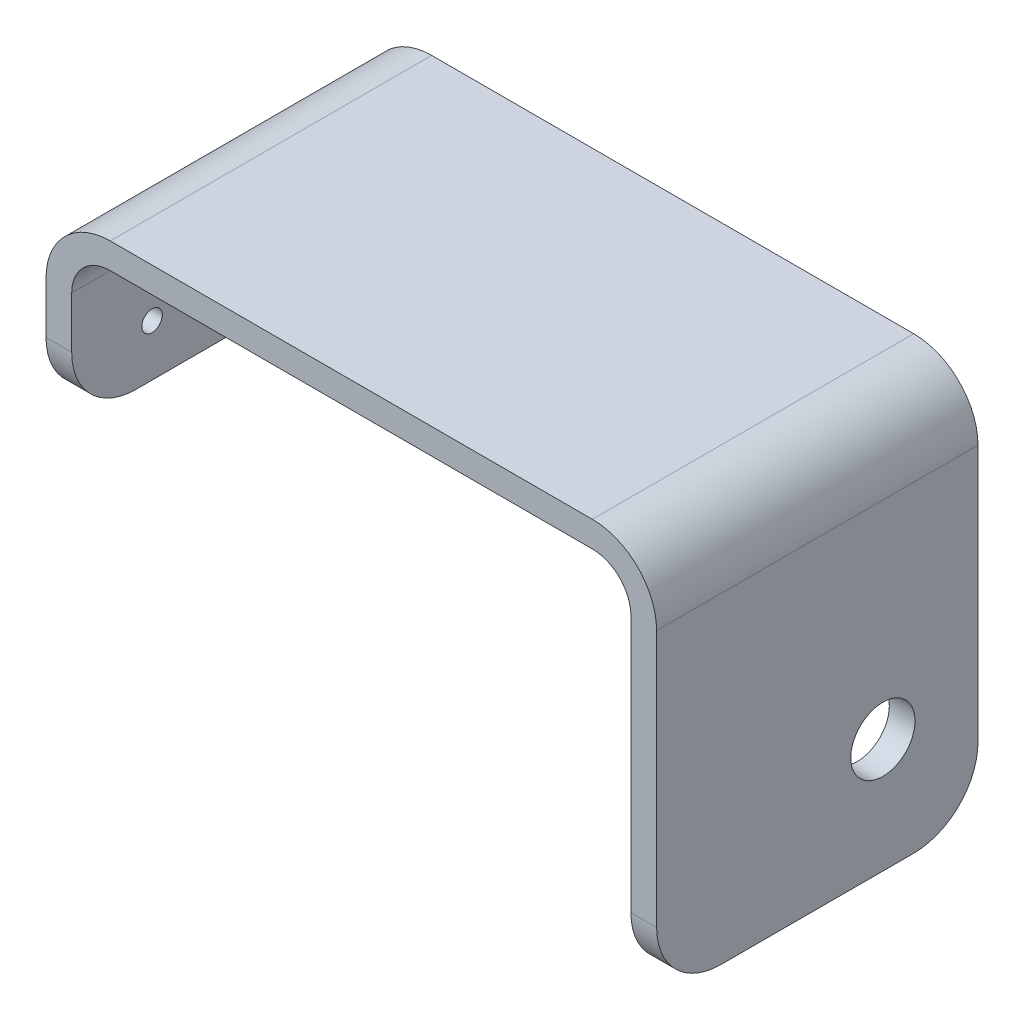
ISO-10303-21;
HEADER;
FILE_DESCRIPTION(('STEP AP214'),'2;1');
FILE_NAME('part.step','',(''),(''),'','','');
FILE_SCHEMA(('AUTOMOTIVE_DESIGN { 1 0 10303 214 1 1 1 1 }'));
ENDSEC;
DATA;
#1=APPLICATION_CONTEXT('core data for automotive mechanical design processes');
#2=APPLICATION_PROTOCOL_DEFINITION('international standard','automotive_design',2000,#1);
#3=PRODUCT_CONTEXT('',#1,'mechanical');
#4=PRODUCT('Part','Part','',(#3));
#5=PRODUCT_RELATED_PRODUCT_CATEGORY('part','',(#4));
#6=PRODUCT_DEFINITION_FORMATION('','',#4);
#7=PRODUCT_DEFINITION_CONTEXT('part definition',#1,'design');
#8=PRODUCT_DEFINITION('design','',#6,#7);
#9=PRODUCT_DEFINITION_SHAPE('','',#8);
#10=(LENGTH_UNIT() NAMED_UNIT(*) SI_UNIT(.MILLI.,.METRE.));
#11=(NAMED_UNIT(*) PLANE_ANGLE_UNIT() SI_UNIT($,.RADIAN.));
#12=(NAMED_UNIT(*) SI_UNIT($,.STERADIAN.) SOLID_ANGLE_UNIT());
#13=UNCERTAINTY_MEASURE_WITH_UNIT(LENGTH_MEASURE(1.E-05),#10,'distance_accuracy_value','');
#14=(GEOMETRIC_REPRESENTATION_CONTEXT(3) GLOBAL_UNCERTAINTY_ASSIGNED_CONTEXT((#13)) GLOBAL_UNIT_ASSIGNED_CONTEXT((#10,
#11,#12)) REPRESENTATION_CONTEXT('',''));
#15=CARTESIAN_POINT('',(0.,0.,0.));
#16=DIRECTION('',(0.,0.,1.));
#17=DIRECTION('',(1.,0.,0.));
#18=AXIS2_PLACEMENT_3D('',#15,#16,#17);
#19=CARTESIAN_POINT('',(0.,-60.,50.));
#20=DIRECTION('',(-1.,0.,0.));
#21=DIRECTION('',(0.,0.,1.));
#22=AXIS2_PLACEMENT_3D('',#19,#20,#21);
#23=PLANE('',#22);
#24=CARTESIAN_POINT('',(0.,-42.25,14.8));
#25=DIRECTION('',(1.,0.,0.));
#26=DIRECTION('',(0.,0.,-1.));
#27=AXIS2_PLACEMENT_3D('',#24,#25,#26);
#28=CIRCLE('',#27,5.);
#29=CARTESIAN_POINT('',(0.,-42.25,9.8));
#30=VERTEX_POINT('',#29);
#31=EDGE_CURVE('E209',#30,#30,#28,.T.);
#32=ORIENTED_EDGE('',*,*,#31,.F.);
#33=EDGE_LOOP('',(#32));
#34=FACE_BOUND('',#33,.T.);
#35=DIRECTION('',(0.,1.,0.));
#36=VECTOR('',#35,1.);
#37=CARTESIAN_POINT('',(0.,-60.,50.));
#38=LINE('',#37,#36);
#39=CARTESIAN_POINT('',(0.,-50.,50.));
#40=VERTEX_POINT('',#39);
#41=CARTESIAN_POINT('',(0.,-10.,50.));
#42=VERTEX_POINT('',#41);
#43=EDGE_CURVE('E187',#40,#42,#38,.T.);
#44=ORIENTED_EDGE('',*,*,#43,.F.);
#45=CARTESIAN_POINT('',(0.,-50.,40.));
#46=DIRECTION('',(-1.,0.,0.));
#47=DIRECTION('',(0.,0.,1.));
#48=AXIS2_PLACEMENT_3D('',#45,#46,#47);
#49=CIRCLE('',#48,10.);
#50=CARTESIAN_POINT('',(0.,-60.,40.));
#51=VERTEX_POINT('',#50);
#52=EDGE_CURVE('E251',#40,#51,#49,.F.);
#53=ORIENTED_EDGE('',*,*,#52,.T.);
#54=DIRECTION('',(0.,0.,-1.));
#55=VECTOR('',#54,1.);
#56=CARTESIAN_POINT('',(0.,-60.,50.));
#57=LINE('',#56,#55);
#58=CARTESIAN_POINT('',(0.,-60.,10.));
#59=VERTEX_POINT('',#58);
#60=EDGE_CURVE('E188',#51,#59,#57,.T.);
#61=ORIENTED_EDGE('',*,*,#60,.T.);
#62=CARTESIAN_POINT('',(0.,-50.,10.));
#63=DIRECTION('',(-1.,0.,0.));
#64=DIRECTION('',(0.,0.,1.));
#65=AXIS2_PLACEMENT_3D('',#62,#63,#64);
#66=CIRCLE('',#65,10.);
#67=CARTESIAN_POINT('',(0.,-50.,0.));
#68=VERTEX_POINT('',#67);
#69=EDGE_CURVE('E249',#59,#68,#66,.F.);
#70=ORIENTED_EDGE('',*,*,#69,.T.);
#71=DIRECTION('',(0.,1.,0.));
#72=VECTOR('',#71,1.);
#73=CARTESIAN_POINT('',(0.,-60.,0.));
#74=LINE('',#73,#72);
#75=CARTESIAN_POINT('',(0.,-10.,0.));
#76=VERTEX_POINT('',#75);
#77=EDGE_CURVE('E178',#68,#76,#74,.T.);
#78=ORIENTED_EDGE('',*,*,#77,.T.);
#79=DIRECTION('',(0.,0.,-1.));
#80=VECTOR('',#79,1.);
#81=CARTESIAN_POINT('',(0.,-10.,50.));
#82=LINE('',#81,#80);
#83=EDGE_CURVE('E220',#76,#42,#82,.F.);
#84=ORIENTED_EDGE('',*,*,#83,.T.);
#85=EDGE_LOOP('',(#44,#53,#61,#70,#78,#84));
#86=FACE_BOUND('',#85,.T.);
#87=ADVANCED_FACE('F35',(#34,#86),#23,.F.);
#88=CARTESIAN_POINT('',(0.,0.,50.));
#89=DIRECTION('',(0.,-1.,0.));
#90=DIRECTION('',(1.,0.,0.));
#91=AXIS2_PLACEMENT_3D('',#88,#89,#90);
#92=PLANE('',#91);
#93=DIRECTION('',(-1.,0.,0.));
#94=VECTOR('',#93,1.);
#95=CARTESIAN_POINT('',(0.,0.,0.));
#96=LINE('',#95,#94);
#97=CARTESIAN_POINT('',(-10.,0.,0.));
#98=VERTEX_POINT('',#97);
#99=CARTESIAN_POINT('',(-85.,0.,0.));
#100=VERTEX_POINT('',#99);
#101=EDGE_CURVE('E174',#98,#100,#96,.T.);
#102=ORIENTED_EDGE('',*,*,#101,.T.);
#103=DIRECTION('',(0.,0.,-1.));
#104=VECTOR('',#103,1.);
#105=CARTESIAN_POINT('',(-85.,0.,50.));
#106=LINE('',#105,#104);
#107=CARTESIAN_POINT('',(-85.,0.,50.));
#108=VERTEX_POINT('',#107);
#109=EDGE_CURVE('E153',#100,#108,#106,.F.);
#110=ORIENTED_EDGE('',*,*,#109,.T.);
#111=DIRECTION('',(-1.,0.,0.));
#112=VECTOR('',#111,1.);
#113=CARTESIAN_POINT('',(0.,0.,50.));
#114=LINE('',#113,#112);
#115=CARTESIAN_POINT('',(-10.,0.,50.));
#116=VERTEX_POINT('',#115);
#117=EDGE_CURVE('E281',#116,#108,#114,.T.);
#118=ORIENTED_EDGE('',*,*,#117,.F.);
#119=DIRECTION('',(0.,0.,-1.));
#120=VECTOR('',#119,1.);
#121=CARTESIAN_POINT('',(-10.,0.,50.));
#122=LINE('',#121,#120);
#123=EDGE_CURVE('E158',#116,#98,#122,.T.);
#124=ORIENTED_EDGE('',*,*,#123,.T.);
#125=EDGE_LOOP('',(#102,#110,#118,#124));
#126=FACE_BOUND('',#125,.T.);
#127=ADVANCED_FACE('F315',(#126),#92,.F.);
#128=CARTESIAN_POINT('',(-95.,0.,50.));
#129=DIRECTION('',(1.,0.,0.));
#130=DIRECTION('',(0.,0.,-1.));
#131=AXIS2_PLACEMENT_3D('',#128,#129,#130);
#132=PLANE('',#131);
#133=CARTESIAN_POINT('',(-95.,-20.,12.5));
#134=DIRECTION('',(-1.,0.,0.));
#135=DIRECTION('',(0.,0.,1.));
#136=AXIS2_PLACEMENT_3D('',#133,#134,#135);
#137=CIRCLE('',#136,1.6);
#138=CARTESIAN_POINT('',(-95.,-20.,14.1));
#139=VERTEX_POINT('',#138);
#140=EDGE_CURVE('E203',#139,#139,#137,.T.);
#141=ORIENTED_EDGE('',*,*,#140,.F.);
#142=EDGE_LOOP('',(#141));
#143=FACE_BOUND('',#142,.T.);
#144=CARTESIAN_POINT('',(-95.,-20.,37.5));
#145=DIRECTION('',(-1.,0.,0.));
#146=DIRECTION('',(0.,0.,1.));
#147=AXIS2_PLACEMENT_3D('',#144,#145,#146);
#148=CIRCLE('',#147,1.6);
#149=CARTESIAN_POINT('',(-95.,-20.,39.1));
#150=VERTEX_POINT('',#149);
#151=EDGE_CURVE('E208',#150,#150,#148,.T.);
#152=ORIENTED_EDGE('',*,*,#151,.F.);
#153=EDGE_LOOP('',(#152));
#154=FACE_BOUND('',#153,.T.);
#155=DIRECTION('',(0.,-1.,0.));
#156=VECTOR('',#155,1.);
#157=CARTESIAN_POINT('',(-95.,0.,0.));
#158=LINE('',#157,#156);
#159=CARTESIAN_POINT('',(-95.,-10.,0.));
#160=VERTEX_POINT('',#159);
#161=CARTESIAN_POINT('',(-95.,-18.,0.));
#162=VERTEX_POINT('',#161);
#163=EDGE_CURVE('E163',#160,#162,#158,.T.);
#164=ORIENTED_EDGE('',*,*,#163,.T.);
#165=CARTESIAN_POINT('',(-95.,-18.,10.));
#166=DIRECTION('',(1.,0.,0.));
#167=DIRECTION('',(0.,0.,-1.));
#168=AXIS2_PLACEMENT_3D('',#165,#166,#167);
#169=CIRCLE('',#168,10.);
#170=CARTESIAN_POINT('',(-95.,-28.,10.));
#171=VERTEX_POINT('',#170);
#172=EDGE_CURVE('E11',#162,#171,#169,.F.);
#173=ORIENTED_EDGE('',*,*,#172,.T.);
#174=DIRECTION('',(0.,0.,-1.));
#175=VECTOR('',#174,1.);
#176=CARTESIAN_POINT('',(-95.,-28.,50.));
#177=LINE('',#176,#175);
#178=CARTESIAN_POINT('',(-95.,-28.,40.));
#179=VERTEX_POINT('',#178);
#180=EDGE_CURVE('E166',#179,#171,#177,.T.);
#181=ORIENTED_EDGE('',*,*,#180,.F.);
#182=CARTESIAN_POINT('',(-95.,-18.,40.));
#183=DIRECTION('',(1.,0.,0.));
#184=DIRECTION('',(0.,0.,-1.));
#185=AXIS2_PLACEMENT_3D('',#182,#183,#184);
#186=CIRCLE('',#185,10.);
#187=CARTESIAN_POINT('',(-95.,-18.,50.));
#188=VERTEX_POINT('',#187);
#189=EDGE_CURVE('E43',#179,#188,#186,.F.);
#190=ORIENTED_EDGE('',*,*,#189,.T.);
#191=DIRECTION('',(0.,-1.,0.));
#192=VECTOR('',#191,1.);
#193=CARTESIAN_POINT('',(-95.,0.,50.));
#194=LINE('',#193,#192);
#195=CARTESIAN_POINT('',(-95.,-10.,50.));
#196=VERTEX_POINT('',#195);
#197=EDGE_CURVE('E165',#196,#188,#194,.T.);
#198=ORIENTED_EDGE('',*,*,#197,.F.);
#199=DIRECTION('',(0.,0.,-1.));
#200=VECTOR('',#199,1.);
#201=CARTESIAN_POINT('',(-95.,-10.,50.));
#202=LINE('',#201,#200);
#203=EDGE_CURVE('E152',#196,#160,#202,.T.);
#204=ORIENTED_EDGE('',*,*,#203,.T.);
#205=EDGE_LOOP('',(#164,#173,#181,#190,#198,#204));
#206=FACE_BOUND('',#205,.T.);
#207=ADVANCED_FACE('F162',(#143,#154,#206),#132,.F.);
#208=CARTESIAN_POINT('',(-95.,-28.,50.));
#209=DIRECTION('',(0.,1.,0.));
#210=DIRECTION('',(0.,0.,1.));
#211=AXIS2_PLACEMENT_3D('',#208,#209,#210);
#212=PLANE('',#211);
#213=ORIENTED_EDGE('',*,*,#180,.T.);
#214=DIRECTION('',(1.,0.,0.));
#215=VECTOR('',#214,1.);
#216=CARTESIAN_POINT('',(-95.,-28.,10.));
#217=LINE('',#216,#215);
#218=CARTESIAN_POINT('',(-91.,-28.,10.));
#219=VERTEX_POINT('',#218);
#220=EDGE_CURVE('E266',#171,#219,#217,.T.);
#221=ORIENTED_EDGE('',*,*,#220,.T.);
#222=DIRECTION('',(0.,0.,-1.));
#223=VECTOR('',#222,1.);
#224=CARTESIAN_POINT('',(-91.,-28.,50.));
#225=LINE('',#224,#223);
#226=CARTESIAN_POINT('',(-91.,-28.,40.));
#227=VERTEX_POINT('',#226);
#228=EDGE_CURVE('E195',#227,#219,#225,.T.);
#229=ORIENTED_EDGE('',*,*,#228,.F.);
#230=DIRECTION('',(1.,0.,0.));
#231=VECTOR('',#230,1.);
#232=CARTESIAN_POINT('',(-95.,-28.,40.));
#233=LINE('',#232,#231);
#234=EDGE_CURVE('E55',#227,#179,#233,.F.);
#235=ORIENTED_EDGE('',*,*,#234,.T.);
#236=EDGE_LOOP('',(#213,#221,#229,#235));
#237=FACE_BOUND('',#236,.T.);
#238=ADVANCED_FACE('F285',(#237),#212,.F.);
#239=CARTESIAN_POINT('',(-91.,-28.,50.));
#240=DIRECTION('',(-1.,0.,0.));
#241=DIRECTION('',(0.,0.,1.));
#242=AXIS2_PLACEMENT_3D('',#239,#240,#241);
#243=PLANE('',#242);
#244=CARTESIAN_POINT('',(-91.,-20.,12.5));
#245=DIRECTION('',(-1.,0.,0.));
#246=DIRECTION('',(0.,0.,1.));
#247=AXIS2_PLACEMENT_3D('',#244,#245,#246);
#248=CIRCLE('',#247,1.6);
#249=CARTESIAN_POINT('',(-91.,-20.,14.1));
#250=VERTEX_POINT('',#249);
#251=EDGE_CURVE('E202',#250,#250,#248,.T.);
#252=ORIENTED_EDGE('',*,*,#251,.T.);
#253=EDGE_LOOP('',(#252));
#254=FACE_BOUND('',#253,.T.);
#255=CARTESIAN_POINT('',(-91.,-20.,37.5));
#256=DIRECTION('',(-1.,0.,0.));
#257=DIRECTION('',(0.,0.,1.));
#258=AXIS2_PLACEMENT_3D('',#255,#256,#257);
#259=CIRCLE('',#258,1.6);
#260=CARTESIAN_POINT('',(-91.,-20.,39.1));
#261=VERTEX_POINT('',#260);
#262=EDGE_CURVE('E199',#261,#261,#259,.T.);
#263=ORIENTED_EDGE('',*,*,#262,.T.);
#264=EDGE_LOOP('',(#263));
#265=FACE_BOUND('',#264,.T.);
#266=ORIENTED_EDGE('',*,*,#228,.T.);
#267=CARTESIAN_POINT('',(-91.,-18.,10.));
#268=DIRECTION('',(-1.,0.,0.));
#269=DIRECTION('',(0.,0.,1.));
#270=AXIS2_PLACEMENT_3D('',#267,#268,#269);
#271=CIRCLE('',#270,10.);
#272=CARTESIAN_POINT('',(-91.,-18.,0.));
#273=VERTEX_POINT('',#272);
#274=EDGE_CURVE('E271',#219,#273,#271,.F.);
#275=ORIENTED_EDGE('',*,*,#274,.T.);
#276=DIRECTION('',(0.,1.,0.));
#277=VECTOR('',#276,1.);
#278=CARTESIAN_POINT('',(-91.,-28.,0.));
#279=LINE('',#278,#277);
#280=CARTESIAN_POINT('',(-91.,-10.,0.));
#281=VERTEX_POINT('',#280);
#282=EDGE_CURVE('E173',#273,#281,#279,.T.);
#283=ORIENTED_EDGE('',*,*,#282,.T.);
#284=DIRECTION('',(0.,0.,-1.));
#285=VECTOR('',#284,1.);
#286=CARTESIAN_POINT('',(-91.,-10.,50.));
#287=LINE('',#286,#285);
#288=CARTESIAN_POINT('',(-91.,-10.,50.));
#289=VERTEX_POINT('',#288);
#290=EDGE_CURVE('E231',#281,#289,#287,.F.);
#291=ORIENTED_EDGE('',*,*,#290,.T.);
#292=DIRECTION('',(0.,1.,0.));
#293=VECTOR('',#292,1.);
#294=CARTESIAN_POINT('',(-91.,-28.,50.));
#295=LINE('',#294,#293);
#296=CARTESIAN_POINT('',(-91.,-18.,50.));
#297=VERTEX_POINT('',#296);
#298=EDGE_CURVE('E280',#297,#289,#295,.T.);
#299=ORIENTED_EDGE('',*,*,#298,.F.);
#300=CARTESIAN_POINT('',(-91.,-18.,40.));
#301=DIRECTION('',(-1.,0.,0.));
#302=DIRECTION('',(0.,0.,1.));
#303=AXIS2_PLACEMENT_3D('',#300,#301,#302);
#304=CIRCLE('',#303,10.);
#305=EDGE_CURVE('E269',#297,#227,#304,.F.);
#306=ORIENTED_EDGE('',*,*,#305,.T.);
#307=EDGE_LOOP('',(#266,#275,#283,#291,#299,#306));
#308=FACE_BOUND('',#307,.T.);
#309=ADVANCED_FACE('F284',(#254,#265,#308),#243,.F.);
#310=CARTESIAN_POINT('',(-91.,-4.00000000000001,50.));
#311=DIRECTION('',(0.,1.,0.));
#312=DIRECTION('',(0.,0.,1.));
#313=AXIS2_PLACEMENT_3D('',#310,#311,#312);
#314=PLANE('',#313);
#315=DIRECTION('',(1.,0.,0.));
#316=VECTOR('',#315,1.);
#317=CARTESIAN_POINT('',(-91.,-4.00000000000001,0.));
#318=LINE('',#317,#316);
#319=CARTESIAN_POINT('',(-85.,-4.00000000000001,0.));
#320=VERTEX_POINT('',#319);
#321=CARTESIAN_POINT('',(-10.,-4.00000000000001,0.));
#322=VERTEX_POINT('',#321);
#323=EDGE_CURVE('E176',#320,#322,#318,.T.);
#324=ORIENTED_EDGE('',*,*,#323,.T.);
#325=DIRECTION('',(0.,0.,-1.));
#326=VECTOR('',#325,1.);
#327=CARTESIAN_POINT('',(-10.,-4.00000000000001,50.));
#328=LINE('',#327,#326);
#329=CARTESIAN_POINT('',(-10.,-4.00000000000001,50.));
#330=VERTEX_POINT('',#329);
#331=EDGE_CURVE('E229',#322,#330,#328,.F.);
#332=ORIENTED_EDGE('',*,*,#331,.T.);
#333=DIRECTION('',(1.,0.,0.));
#334=VECTOR('',#333,1.);
#335=CARTESIAN_POINT('',(-91.,-4.00000000000001,50.));
#336=LINE('',#335,#334);
#337=CARTESIAN_POINT('',(-85.,-4.00000000000001,50.));
#338=VERTEX_POINT('',#337);
#339=EDGE_CURVE('E297',#338,#330,#336,.T.);
#340=ORIENTED_EDGE('',*,*,#339,.F.);
#341=DIRECTION('',(0.,0.,-1.));
#342=VECTOR('',#341,1.);
#343=CARTESIAN_POINT('',(-85.,-4.00000000000001,0.));
#344=LINE('',#343,#342);
#345=EDGE_CURVE('E226',#338,#320,#344,.T.);
#346=ORIENTED_EDGE('',*,*,#345,.T.);
#347=EDGE_LOOP('',(#324,#332,#340,#346));
#348=FACE_BOUND('',#347,.T.);
#349=ADVANCED_FACE('F300',(#348),#314,.F.);
#350=CARTESIAN_POINT('',(-4.,-4.00000000000001,50.));
#351=DIRECTION('',(1.,0.,0.));
#352=DIRECTION('',(0.,1.,0.));
#353=AXIS2_PLACEMENT_3D('',#350,#351,#352);
#354=PLANE('',#353);
#355=CARTESIAN_POINT('',(-4.,-42.25,14.8));
#356=DIRECTION('',(1.,0.,0.));
#357=DIRECTION('',(0.,1.,0.));
#358=AXIS2_PLACEMENT_3D('',#355,#356,#357);
#359=CIRCLE('',#358,5.);
#360=CARTESIAN_POINT('',(-4.,-37.25,14.8));
#361=VERTEX_POINT('',#360);
#362=EDGE_CURVE('E206',#361,#361,#359,.T.);
#363=ORIENTED_EDGE('',*,*,#362,.T.);
#364=EDGE_LOOP('',(#363));
#365=FACE_BOUND('',#364,.T.);
#366=DIRECTION('',(0.,0.,-1.));
#367=VECTOR('',#366,1.);
#368=CARTESIAN_POINT('',(-3.99999999999999,-60.,50.));
#369=LINE('',#368,#367);
#370=CARTESIAN_POINT('',(-3.99999999999999,-60.,40.));
#371=VERTEX_POINT('',#370);
#372=CARTESIAN_POINT('',(-3.99999999999999,-60.,10.));
#373=VERTEX_POINT('',#372);
#374=EDGE_CURVE('E191',#371,#373,#369,.T.);
#375=ORIENTED_EDGE('',*,*,#374,.F.);
#376=CARTESIAN_POINT('',(-3.99999999999999,-50.,40.));
#377=DIRECTION('',(1.,0.,0.));
#378=DIRECTION('',(0.,1.,0.));
#379=AXIS2_PLACEMENT_3D('',#376,#377,#378);
#380=CIRCLE('',#379,10.);
#381=CARTESIAN_POINT('',(-3.99999999999999,-50.,50.));
#382=VERTEX_POINT('',#381);
#383=EDGE_CURVE('E260',#371,#382,#380,.F.);
#384=ORIENTED_EDGE('',*,*,#383,.T.);
#385=DIRECTION('',(0.,-1.,0.));
#386=VECTOR('',#385,1.);
#387=CARTESIAN_POINT('',(-4.,-4.00000000000001,50.));
#388=LINE('',#387,#386);
#389=CARTESIAN_POINT('',(-4.,-10.,50.));
#390=VERTEX_POINT('',#389);
#391=EDGE_CURVE('E192',#390,#382,#388,.T.);
#392=ORIENTED_EDGE('',*,*,#391,.F.);
#393=DIRECTION('',(0.,0.,-1.));
#394=VECTOR('',#393,1.);
#395=CARTESIAN_POINT('',(-4.,-10.,0.));
#396=LINE('',#395,#394);
#397=CARTESIAN_POINT('',(-4.,-10.,0.));
#398=VERTEX_POINT('',#397);
#399=EDGE_CURVE('E223',#390,#398,#396,.T.);
#400=ORIENTED_EDGE('',*,*,#399,.T.);
#401=DIRECTION('',(0.,-1.,0.));
#402=VECTOR('',#401,1.);
#403=CARTESIAN_POINT('',(-4.,-4.00000000000001,0.));
#404=LINE('',#403,#402);
#405=CARTESIAN_POINT('',(-3.99999999999999,-50.,0.));
#406=VERTEX_POINT('',#405);
#407=EDGE_CURVE('E184',#398,#406,#404,.T.);
#408=ORIENTED_EDGE('',*,*,#407,.T.);
#409=CARTESIAN_POINT('',(-3.99999999999999,-50.,10.));
#410=DIRECTION('',(1.,0.,0.));
#411=DIRECTION('',(0.,1.,0.));
#412=AXIS2_PLACEMENT_3D('',#409,#410,#411);
#413=CIRCLE('',#412,10.);
#414=EDGE_CURVE('E258',#406,#373,#413,.F.);
#415=ORIENTED_EDGE('',*,*,#414,.T.);
#416=EDGE_LOOP('',(#375,#384,#392,#400,#408,#415));
#417=FACE_BOUND('',#416,.T.);
#418=ADVANCED_FACE('F406',(#365,#417),#354,.F.);
#419=CARTESIAN_POINT('',(-3.99999999999999,-60.,50.));
#420=DIRECTION('',(0.,1.,0.));
#421=DIRECTION('',(0.,0.,1.));
#422=AXIS2_PLACEMENT_3D('',#419,#420,#421);
#423=PLANE('',#422);
#424=ORIENTED_EDGE('',*,*,#60,.F.);
#425=DIRECTION('',(1.,0.,0.));
#426=VECTOR('',#425,1.);
#427=CARTESIAN_POINT('',(-3.99999999999999,-60.,40.));
#428=LINE('',#427,#426);
#429=EDGE_CURVE('E256',#51,#371,#428,.F.);
#430=ORIENTED_EDGE('',*,*,#429,.T.);
#431=ORIENTED_EDGE('',*,*,#374,.T.);
#432=DIRECTION('',(1.,0.,0.));
#433=VECTOR('',#432,1.);
#434=CARTESIAN_POINT('',(-3.99999999999999,-60.,10.));
#435=LINE('',#434,#433);
#436=EDGE_CURVE('E253',#373,#59,#435,.T.);
#437=ORIENTED_EDGE('',*,*,#436,.T.);
#438=EDGE_LOOP('',(#424,#430,#431,#437));
#439=FACE_BOUND('',#438,.T.);
#440=ADVANCED_FACE('F397',(#439),#423,.F.);
#441=CARTESIAN_POINT('',(0.,0.,50.));
#442=DIRECTION('',(0.,0.,1.));
#443=DIRECTION('',(1.,0.,0.));
#444=AXIS2_PLACEMENT_3D('',#441,#442,#443);
#445=PLANE('',#444);
#446=ORIENTED_EDGE('',*,*,#391,.T.);
#447=DIRECTION('',(1.,0.,0.));
#448=VECTOR('',#447,1.);
#449=CARTESIAN_POINT('',(0.,-50.,50.));
#450=LINE('',#449,#448);
#451=EDGE_CURVE('E246',#382,#40,#450,.T.);
#452=ORIENTED_EDGE('',*,*,#451,.T.);
#453=ORIENTED_EDGE('',*,*,#43,.T.);
#454=CARTESIAN_POINT('',(-10.,-10.,50.));
#455=DIRECTION('',(0.,0.,1.));
#456=DIRECTION('',(1.,0.,0.));
#457=AXIS2_PLACEMENT_3D('',#454,#455,#456);
#458=CIRCLE('',#457,10.);
#459=EDGE_CURVE('E216',#42,#116,#458,.T.);
#460=ORIENTED_EDGE('',*,*,#459,.T.);
#461=ORIENTED_EDGE('',*,*,#117,.T.);
#462=CARTESIAN_POINT('',(-85.,-10.,50.));
#463=DIRECTION('',(0.,0.,1.));
#464=DIRECTION('',(1.,0.,0.));
#465=AXIS2_PLACEMENT_3D('',#462,#463,#464);
#466=CIRCLE('',#465,10.);
#467=EDGE_CURVE('E218',#108,#196,#466,.T.);
#468=ORIENTED_EDGE('',*,*,#467,.T.);
#469=ORIENTED_EDGE('',*,*,#197,.T.);
#470=DIRECTION('',(1.,0.,0.));
#471=VECTOR('',#470,1.);
#472=CARTESIAN_POINT('',(-91.,-18.,50.));
#473=LINE('',#472,#471);
#474=EDGE_CURVE('E243',#188,#297,#473,.T.);
#475=ORIENTED_EDGE('',*,*,#474,.T.);
#476=ORIENTED_EDGE('',*,*,#298,.T.);
#477=CARTESIAN_POINT('',(-85.,-10.,50.));
#478=DIRECTION('',(0.,0.,1.));
#479=DIRECTION('',(1.,0.,0.));
#480=AXIS2_PLACEMENT_3D('',#477,#478,#479);
#481=CIRCLE('',#480,6.);
#482=EDGE_CURVE('E241',#289,#338,#481,.F.);
#483=ORIENTED_EDGE('',*,*,#482,.T.);
#484=ORIENTED_EDGE('',*,*,#339,.T.);
#485=CARTESIAN_POINT('',(-10.,-10.,50.));
#486=DIRECTION('',(0.,0.,1.));
#487=DIRECTION('',(1.,0.,0.));
#488=AXIS2_PLACEMENT_3D('',#485,#486,#487);
#489=CIRCLE('',#488,6.);
#490=EDGE_CURVE('E236',#330,#390,#489,.F.);
#491=ORIENTED_EDGE('',*,*,#490,.T.);
#492=EDGE_LOOP('',(#446,#452,#453,#460,#461,#468,#469,#475,#476,#483,#484,#491));
#493=FACE_BOUND('',#492,.T.);
#494=ADVANCED_FACE('F277',(#493),#445,.T.);
#495=CARTESIAN_POINT('',(0.,0.,0.));
#496=DIRECTION('',(0.,0.,1.));
#497=DIRECTION('',(1.,0.,0.));
#498=AXIS2_PLACEMENT_3D('',#495,#496,#497);
#499=PLANE('',#498);
#500=ORIENTED_EDGE('',*,*,#77,.F.);
#501=DIRECTION('',(1.,0.,0.));
#502=VECTOR('',#501,1.);
#503=CARTESIAN_POINT('',(0.,-50.,0.));
#504=LINE('',#503,#502);
#505=EDGE_CURVE('E263',#68,#406,#504,.F.);
#506=ORIENTED_EDGE('',*,*,#505,.T.);
#507=ORIENTED_EDGE('',*,*,#407,.F.);
#508=CARTESIAN_POINT('',(-10.,-10.,0.));
#509=DIRECTION('',(0.,0.,1.));
#510=DIRECTION('',(1.,0.,0.));
#511=AXIS2_PLACEMENT_3D('',#508,#509,#510);
#512=CIRCLE('',#511,6.);
#513=EDGE_CURVE('E234',#398,#322,#512,.T.);
#514=ORIENTED_EDGE('',*,*,#513,.T.);
#515=ORIENTED_EDGE('',*,*,#323,.F.);
#516=CARTESIAN_POINT('',(-85.,-10.,0.));
#517=DIRECTION('',(0.,0.,1.));
#518=DIRECTION('',(1.,0.,0.));
#519=AXIS2_PLACEMENT_3D('',#516,#517,#518);
#520=CIRCLE('',#519,6.);
#521=EDGE_CURVE('E238',#320,#281,#520,.T.);
#522=ORIENTED_EDGE('',*,*,#521,.T.);
#523=ORIENTED_EDGE('',*,*,#282,.F.);
#524=DIRECTION('',(1.,0.,0.));
#525=VECTOR('',#524,1.);
#526=CARTESIAN_POINT('',(0.,-18.,0.));
#527=LINE('',#526,#525);
#528=EDGE_CURVE('E172',#273,#162,#527,.F.);
#529=ORIENTED_EDGE('',*,*,#528,.T.);
#530=ORIENTED_EDGE('',*,*,#163,.F.);
#531=CARTESIAN_POINT('',(-85.,-10.,0.));
#532=DIRECTION('',(0.,0.,1.));
#533=DIRECTION('',(1.,0.,0.));
#534=AXIS2_PLACEMENT_3D('',#531,#532,#533);
#535=CIRCLE('',#534,10.);
#536=EDGE_CURVE('E148',#160,#100,#535,.F.);
#537=ORIENTED_EDGE('',*,*,#536,.T.);
#538=ORIENTED_EDGE('',*,*,#101,.F.);
#539=CARTESIAN_POINT('',(-10.,-10.,0.));
#540=DIRECTION('',(0.,0.,1.));
#541=DIRECTION('',(1.,0.,0.));
#542=AXIS2_PLACEMENT_3D('',#539,#540,#541);
#543=CIRCLE('',#542,10.);
#544=EDGE_CURVE('E159',#98,#76,#543,.F.);
#545=ORIENTED_EDGE('',*,*,#544,.T.);
#546=EDGE_LOOP('',(#500,#506,#507,#514,#515,#522,#523,#529,#530,#537,#538,#545));
#547=FACE_BOUND('',#546,.T.);
#548=ADVANCED_FACE('F169',(#547),#499,.F.);
#549=CARTESIAN_POINT('',(-45.,-20.,37.5));
#550=DIRECTION('',(-1.,0.,0.));
#551=DIRECTION('',(0.,0.,1.));
#552=AXIS2_PLACEMENT_3D('',#549,#550,#551);
#553=CYLINDRICAL_SURFACE('',#552,1.6);
#554=ORIENTED_EDGE('',*,*,#151,.T.);
#555=EDGE_LOOP('',(#554));
#556=FACE_BOUND('',#555,.T.);
#557=ORIENTED_EDGE('',*,*,#262,.F.);
#558=EDGE_LOOP('',(#557));
#559=FACE_BOUND('',#558,.T.);
#560=ADVANCED_FACE('F386',(#556,#559),#553,.F.);
#561=CARTESIAN_POINT('',(-45.,-20.,12.5));
#562=DIRECTION('',(-1.,0.,0.));
#563=DIRECTION('',(0.,0.,1.));
#564=AXIS2_PLACEMENT_3D('',#561,#562,#563);
#565=CYLINDRICAL_SURFACE('',#564,1.6);
#566=ORIENTED_EDGE('',*,*,#140,.T.);
#567=EDGE_LOOP('',(#566));
#568=FACE_BOUND('',#567,.T.);
#569=ORIENTED_EDGE('',*,*,#251,.F.);
#570=EDGE_LOOP('',(#569));
#571=FACE_BOUND('',#570,.T.);
#572=ADVANCED_FACE('F491',(#568,#571),#565,.F.);
#573=CARTESIAN_POINT('',(-50.,-42.25,14.8));
#574=DIRECTION('',(1.,0.,0.));
#575=DIRECTION('',(0.,0.,-1.));
#576=AXIS2_PLACEMENT_3D('',#573,#574,#575);
#577=CYLINDRICAL_SURFACE('',#576,5.);
#578=ORIENTED_EDGE('',*,*,#31,.T.);
#579=EDGE_LOOP('',(#578));
#580=FACE_BOUND('',#579,.T.);
#581=ORIENTED_EDGE('',*,*,#362,.F.);
#582=EDGE_LOOP('',(#581));
#583=FACE_BOUND('',#582,.T.);
#584=ADVANCED_FACE('F326',(#580,#583),#577,.F.);
#585=CARTESIAN_POINT('',(-85.,-10.,50.));
#586=DIRECTION('',(0.,0.,-1.));
#587=DIRECTION('',(-1.,0.,0.));
#588=AXIS2_PLACEMENT_3D('',#585,#586,#587);
#589=CYLINDRICAL_SURFACE('',#588,10.);
#590=ORIENTED_EDGE('',*,*,#467,.F.);
#591=ORIENTED_EDGE('',*,*,#109,.F.);
#592=ORIENTED_EDGE('',*,*,#536,.F.);
#593=ORIENTED_EDGE('',*,*,#203,.F.);
#594=EDGE_LOOP('',(#590,#591,#592,#593));
#595=FACE_BOUND('',#594,.T.);
#596=ADVANCED_FACE('F151',(#595),#589,.T.);
#597=CARTESIAN_POINT('',(-10.,-10.,50.));
#598=DIRECTION('',(0.,0.,-1.));
#599=DIRECTION('',(-1.,0.,0.));
#600=AXIS2_PLACEMENT_3D('',#597,#598,#599);
#601=CYLINDRICAL_SURFACE('',#600,10.);
#602=ORIENTED_EDGE('',*,*,#459,.F.);
#603=ORIENTED_EDGE('',*,*,#83,.F.);
#604=ORIENTED_EDGE('',*,*,#544,.F.);
#605=ORIENTED_EDGE('',*,*,#123,.F.);
#606=EDGE_LOOP('',(#602,#603,#604,#605));
#607=FACE_BOUND('',#606,.T.);
#608=ADVANCED_FACE('F312',(#607),#601,.T.);
#609=CARTESIAN_POINT('',(-10.,-10.,50.));
#610=DIRECTION('',(0.,0.,1.));
#611=DIRECTION('',(1.,0.,0.));
#612=AXIS2_PLACEMENT_3D('',#609,#610,#611);
#613=CYLINDRICAL_SURFACE('',#612,6.);
#614=ORIENTED_EDGE('',*,*,#490,.F.);
#615=ORIENTED_EDGE('',*,*,#331,.F.);
#616=ORIENTED_EDGE('',*,*,#513,.F.);
#617=ORIENTED_EDGE('',*,*,#399,.F.);
#618=EDGE_LOOP('',(#614,#615,#616,#617));
#619=FACE_BOUND('',#618,.T.);
#620=ADVANCED_FACE('F341',(#619),#613,.F.);
#621=CARTESIAN_POINT('',(-85.,-10.,50.));
#622=DIRECTION('',(0.,0.,1.));
#623=DIRECTION('',(1.,0.,0.));
#624=AXIS2_PLACEMENT_3D('',#621,#622,#623);
#625=CYLINDRICAL_SURFACE('',#624,6.);
#626=ORIENTED_EDGE('',*,*,#482,.F.);
#627=ORIENTED_EDGE('',*,*,#290,.F.);
#628=ORIENTED_EDGE('',*,*,#521,.F.);
#629=ORIENTED_EDGE('',*,*,#345,.F.);
#630=EDGE_LOOP('',(#626,#627,#628,#629));
#631=FACE_BOUND('',#630,.T.);
#632=ADVANCED_FACE('F294',(#631),#625,.F.);
#633=CARTESIAN_POINT('',(0.,-50.,40.));
#634=DIRECTION('',(-1.,0.,0.));
#635=DIRECTION('',(0.,0.,1.));
#636=AXIS2_PLACEMENT_3D('',#633,#634,#635);
#637=CYLINDRICAL_SURFACE('',#636,10.);
#638=ORIENTED_EDGE('',*,*,#383,.F.);
#639=ORIENTED_EDGE('',*,*,#429,.F.);
#640=ORIENTED_EDGE('',*,*,#52,.F.);
#641=ORIENTED_EDGE('',*,*,#451,.F.);
#642=EDGE_LOOP('',(#638,#639,#640,#641));
#643=FACE_BOUND('',#642,.T.);
#644=ADVANCED_FACE('F347',(#643),#637,.T.);
#645=CARTESIAN_POINT('',(-3.99999999999999,-50.,10.));
#646=DIRECTION('',(1.,0.,0.));
#647=DIRECTION('',(0.,0.,-1.));
#648=AXIS2_PLACEMENT_3D('',#645,#646,#647);
#649=CYLINDRICAL_SURFACE('',#648,10.);
#650=ORIENTED_EDGE('',*,*,#414,.F.);
#651=ORIENTED_EDGE('',*,*,#505,.F.);
#652=ORIENTED_EDGE('',*,*,#69,.F.);
#653=ORIENTED_EDGE('',*,*,#436,.F.);
#654=EDGE_LOOP('',(#650,#651,#652,#653));
#655=FACE_BOUND('',#654,.T.);
#656=ADVANCED_FACE('F350',(#655),#649,.T.);
#657=CARTESIAN_POINT('',(-95.,-18.,10.));
#658=DIRECTION('',(1.,0.,0.));
#659=DIRECTION('',(0.,0.,-1.));
#660=AXIS2_PLACEMENT_3D('',#657,#658,#659);
#661=CYLINDRICAL_SURFACE('',#660,10.);
#662=ORIENTED_EDGE('',*,*,#172,.F.);
#663=ORIENTED_EDGE('',*,*,#528,.F.);
#664=ORIENTED_EDGE('',*,*,#274,.F.);
#665=ORIENTED_EDGE('',*,*,#220,.F.);
#666=EDGE_LOOP('',(#662,#663,#664,#665));
#667=FACE_BOUND('',#666,.T.);
#668=ADVANCED_FACE('F288',(#667),#661,.T.);
#669=CARTESIAN_POINT('',(0.,-18.,40.));
#670=DIRECTION('',(-1.,0.,0.));
#671=DIRECTION('',(0.,0.,1.));
#672=AXIS2_PLACEMENT_3D('',#669,#670,#671);
#673=CYLINDRICAL_SURFACE('',#672,10.);
#674=ORIENTED_EDGE('',*,*,#189,.F.);
#675=ORIENTED_EDGE('',*,*,#234,.F.);
#676=ORIENTED_EDGE('',*,*,#305,.F.);
#677=ORIENTED_EDGE('',*,*,#474,.F.);
#678=EDGE_LOOP('',(#674,#675,#676,#677));
#679=FACE_BOUND('',#678,.T.);
#680=ADVANCED_FACE('F37',(#679),#673,.T.);
#681=CLOSED_SHELL('',(#87,#127,#207,#238,#309,#349,#418,#440,#494,#548,#560,#572,#584,#596,#608,
#620,#632,#644,#656,#668,#680));
#682=MANIFOLD_SOLID_BREP('B2',#681);
#683=ADVANCED_BREP_SHAPE_REPRESENTATION('',(#18,#682),#14);
#684=SHAPE_DEFINITION_REPRESENTATION(#9,#683);
ENDSEC;
END-ISO-10303-21;
